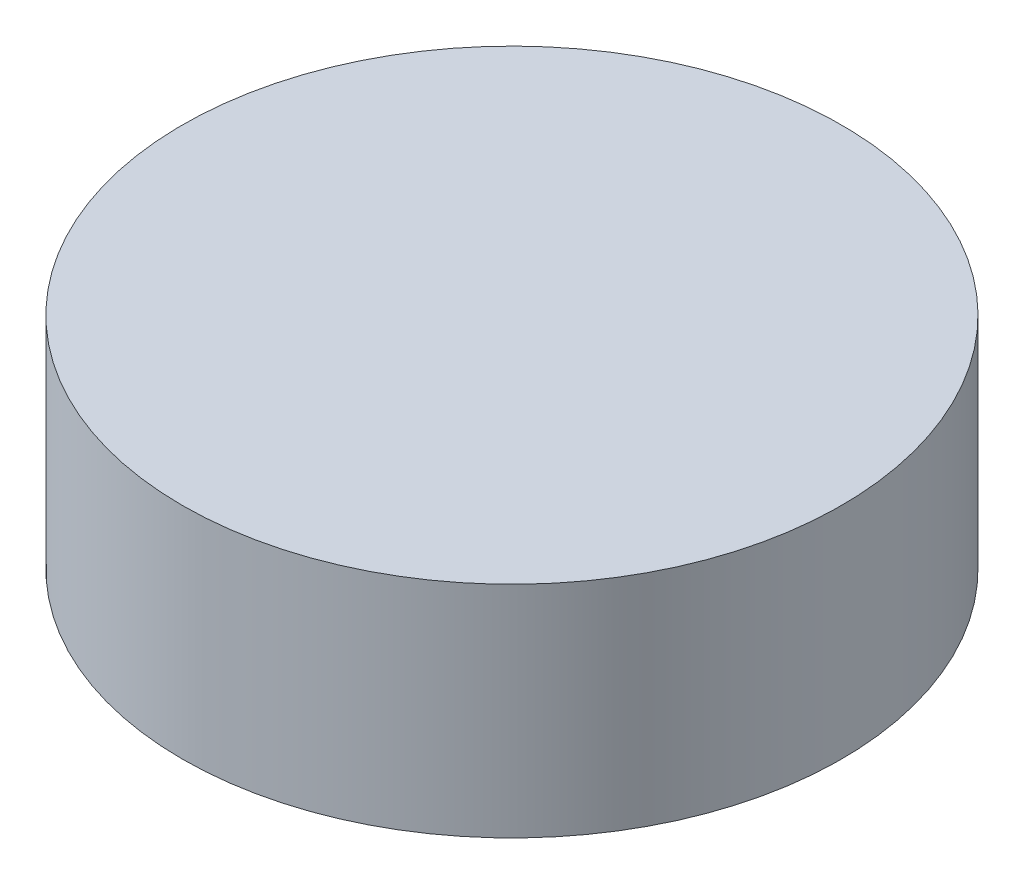
ISO-10303-21;
HEADER;
FILE_DESCRIPTION(('STEP AP214'),'2;1');
FILE_NAME('part.step','',(''),(''),'','','');
FILE_SCHEMA(('AUTOMOTIVE_DESIGN { 1 0 10303 214 1 1 1 1 }'));
ENDSEC;
DATA;
#1=APPLICATION_CONTEXT('core data for automotive mechanical design processes');
#2=APPLICATION_PROTOCOL_DEFINITION('international standard','automotive_design',2000,#1);
#3=PRODUCT_CONTEXT('',#1,'mechanical');
#4=PRODUCT('Part','Part','',(#3));
#5=PRODUCT_RELATED_PRODUCT_CATEGORY('part','',(#4));
#6=PRODUCT_DEFINITION_FORMATION('','',#4);
#7=PRODUCT_DEFINITION_CONTEXT('part definition',#1,'design');
#8=PRODUCT_DEFINITION('design','',#6,#7);
#9=PRODUCT_DEFINITION_SHAPE('','',#8);
#10=(LENGTH_UNIT() NAMED_UNIT(*) SI_UNIT(.MILLI.,.METRE.));
#11=(NAMED_UNIT(*) PLANE_ANGLE_UNIT() SI_UNIT($,.RADIAN.));
#12=(NAMED_UNIT(*) SI_UNIT($,.STERADIAN.) SOLID_ANGLE_UNIT());
#13=UNCERTAINTY_MEASURE_WITH_UNIT(LENGTH_MEASURE(1.E-05),#10,'distance_accuracy_value','');
#14=(GEOMETRIC_REPRESENTATION_CONTEXT(3) GLOBAL_UNCERTAINTY_ASSIGNED_CONTEXT((#13)) GLOBAL_UNIT_ASSIGNED_CONTEXT((#10,
#11,#12)) REPRESENTATION_CONTEXT('',''));
#15=CARTESIAN_POINT('',(0.,0.,0.));
#16=DIRECTION('',(0.,0.,1.));
#17=DIRECTION('',(1.,0.,0.));
#18=AXIS2_PLACEMENT_3D('',#15,#16,#17);
#19=CARTESIAN_POINT('',(0.,2.,0.));
#20=DIRECTION('',(0.,-1.,0.));
#21=DIRECTION('',(0.,0.,-1.));
#22=AXIS2_PLACEMENT_3D('',#19,#20,#21);
#23=CYLINDRICAL_SURFACE('',#22,3.);
#24=CARTESIAN_POINT('',(0.,2.,0.));
#25=DIRECTION('',(0.,1.,0.));
#26=DIRECTION('',(0.,0.,1.));
#27=AXIS2_PLACEMENT_3D('',#24,#25,#26);
#28=CIRCLE('',#27,3.);
#29=CARTESIAN_POINT('',(0.,2.,3.));
#30=VERTEX_POINT('',#29);
#31=EDGE_CURVE('E10',#30,#30,#28,.T.);
#32=ORIENTED_EDGE('',*,*,#31,.F.);
#33=EDGE_LOOP('',(#32));
#34=FACE_BOUND('',#33,.T.);
#35=CARTESIAN_POINT('',(0.,0.,0.));
#36=DIRECTION('',(0.,1.,0.));
#37=DIRECTION('',(0.,0.,1.));
#38=AXIS2_PLACEMENT_3D('',#35,#36,#37);
#39=CIRCLE('',#38,3.);
#40=CARTESIAN_POINT('',(0.,0.,3.));
#41=VERTEX_POINT('',#40);
#42=EDGE_CURVE('E36',#41,#41,#39,.T.);
#43=ORIENTED_EDGE('',*,*,#42,.T.);
#44=EDGE_LOOP('',(#43));
#45=FACE_BOUND('',#44,.T.);
#46=ADVANCED_FACE('F33',(#34,#45),#23,.T.);
#47=CARTESIAN_POINT('',(0.,2.,0.));
#48=DIRECTION('',(0.,1.,0.));
#49=DIRECTION('',(0.,0.,1.));
#50=AXIS2_PLACEMENT_3D('',#47,#48,#49);
#51=PLANE('',#50);
#52=ORIENTED_EDGE('',*,*,#31,.T.);
#53=EDGE_LOOP('',(#52));
#54=FACE_BOUND('',#53,.T.);
#55=ADVANCED_FACE('F48',(#54),#51,.T.);
#56=CARTESIAN_POINT('',(0.,0.,0.));
#57=DIRECTION('',(0.,1.,0.));
#58=DIRECTION('',(0.,0.,1.));
#59=AXIS2_PLACEMENT_3D('',#56,#57,#58);
#60=PLANE('',#59);
#61=ORIENTED_EDGE('',*,*,#42,.F.);
#62=EDGE_LOOP('',(#61));
#63=FACE_BOUND('',#62,.T.);
#64=ADVANCED_FACE('F46',(#63),#60,.F.);
#65=CLOSED_SHELL('',(#46,#55,#64));
#66=MANIFOLD_SOLID_BREP('B2',#65);
#67=ADVANCED_BREP_SHAPE_REPRESENTATION('',(#18,#66),#14);
#68=SHAPE_DEFINITION_REPRESENTATION(#9,#67);
ENDSEC;
END-ISO-10303-21;
